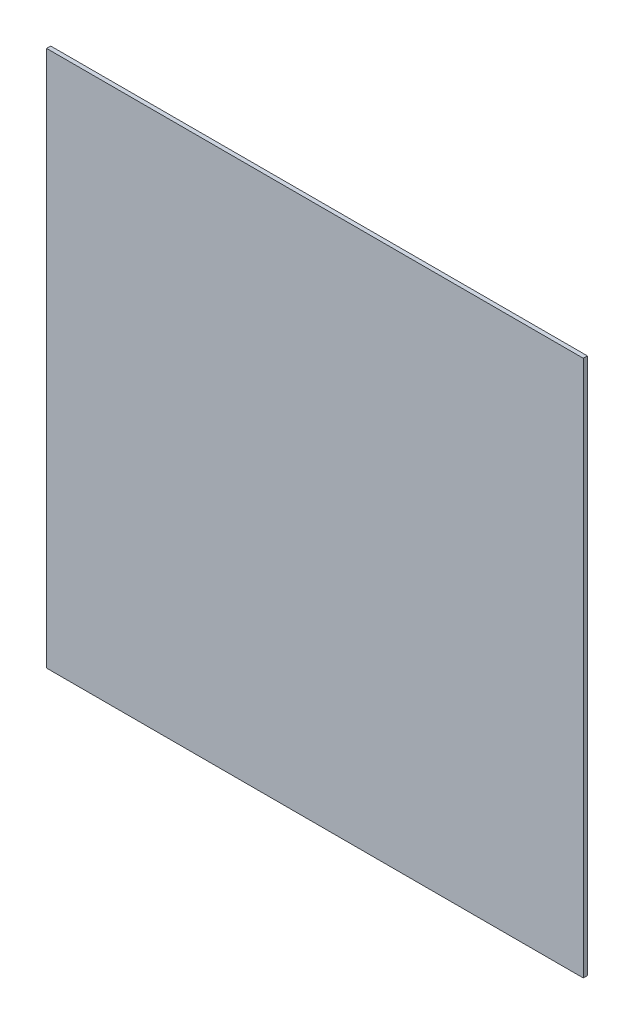
ISO-10303-21;
HEADER;
FILE_DESCRIPTION(('STEP AP214'),'2;1');
FILE_NAME('part.step','',(''),(''),'','','');
FILE_SCHEMA(('AUTOMOTIVE_DESIGN { 1 0 10303 214 1 1 1 1 }'));
ENDSEC;
DATA;
#1=APPLICATION_CONTEXT('core data for automotive mechanical design processes');
#2=APPLICATION_PROTOCOL_DEFINITION('international standard','automotive_design',2000,#1);
#3=PRODUCT_CONTEXT('',#1,'mechanical');
#4=PRODUCT('Part','Part','',(#3));
#5=PRODUCT_RELATED_PRODUCT_CATEGORY('part','',(#4));
#6=PRODUCT_DEFINITION_FORMATION('','',#4);
#7=PRODUCT_DEFINITION_CONTEXT('part definition',#1,'design');
#8=PRODUCT_DEFINITION('design','',#6,#7);
#9=PRODUCT_DEFINITION_SHAPE('','',#8);
#10=(LENGTH_UNIT() NAMED_UNIT(*) SI_UNIT(.MILLI.,.METRE.));
#11=(NAMED_UNIT(*) PLANE_ANGLE_UNIT() SI_UNIT($,.RADIAN.));
#12=(NAMED_UNIT(*) SI_UNIT($,.STERADIAN.) SOLID_ANGLE_UNIT());
#13=UNCERTAINTY_MEASURE_WITH_UNIT(LENGTH_MEASURE(1.E-05),#10,'distance_accuracy_value','');
#14=(GEOMETRIC_REPRESENTATION_CONTEXT(3) GLOBAL_UNCERTAINTY_ASSIGNED_CONTEXT((#13)) GLOBAL_UNIT_ASSIGNED_CONTEXT((#10,
#11,#12)) REPRESENTATION_CONTEXT('',''));
#15=CARTESIAN_POINT('',(0.,0.,0.));
#16=DIRECTION('',(0.,0.,1.));
#17=DIRECTION('',(1.,0.,0.));
#18=AXIS2_PLACEMENT_3D('',#15,#16,#17);
#19=CARTESIAN_POINT('',(650.,-650.,-7.));
#20=DIRECTION('',(1.,0.,0.));
#21=DIRECTION('',(0.,0.,-1.));
#22=AXIS2_PLACEMENT_3D('',#19,#20,#21);
#23=PLANE('',#22);
#24=DIRECTION('',(0.,1.,0.));
#25=VECTOR('',#24,1.);
#26=CARTESIAN_POINT('',(650.,-650.,3.));
#27=LINE('',#26,#25);
#28=CARTESIAN_POINT('',(650.,-650.,3.));
#29=VERTEX_POINT('',#28);
#30=CARTESIAN_POINT('',(650.,650.,3.));
#31=VERTEX_POINT('',#30);
#32=EDGE_CURVE('E99',#29,#31,#27,.T.);
#33=ORIENTED_EDGE('',*,*,#32,.F.);
#34=DIRECTION('',(0.,0.,1.));
#35=VECTOR('',#34,1.);
#36=CARTESIAN_POINT('',(650.,-650.,-7.));
#37=LINE('',#36,#35);
#38=CARTESIAN_POINT('',(650.,-650.,-7.));
#39=VERTEX_POINT('',#38);
#40=EDGE_CURVE('E11',#39,#29,#37,.T.);
#41=ORIENTED_EDGE('',*,*,#40,.F.);
#42=DIRECTION('',(0.,1.,0.));
#43=VECTOR('',#42,1.);
#44=CARTESIAN_POINT('',(650.,-650.,-7.));
#45=LINE('',#44,#43);
#46=CARTESIAN_POINT('',(650.,650.,-7.));
#47=VERTEX_POINT('',#46);
#48=EDGE_CURVE('E93',#39,#47,#45,.T.);
#49=ORIENTED_EDGE('',*,*,#48,.T.);
#50=DIRECTION('',(0.,0.,1.));
#51=VECTOR('',#50,1.);
#52=CARTESIAN_POINT('',(650.,650.,-7.));
#53=LINE('',#52,#51);
#54=EDGE_CURVE('E38',#47,#31,#53,.T.);
#55=ORIENTED_EDGE('',*,*,#54,.T.);
#56=EDGE_LOOP('',(#33,#41,#49,#55));
#57=FACE_BOUND('',#56,.T.);
#58=ADVANCED_FACE('F35',(#57),#23,.T.);
#59=CARTESIAN_POINT('',(-650.,-650.,-7.));
#60=DIRECTION('',(0.,-1.,0.));
#61=DIRECTION('',(0.,0.,-1.));
#62=AXIS2_PLACEMENT_3D('',#59,#60,#61);
#63=PLANE('',#62);
#64=DIRECTION('',(1.,0.,0.));
#65=VECTOR('',#64,1.);
#66=CARTESIAN_POINT('',(-650.,-650.,3.));
#67=LINE('',#66,#65);
#68=CARTESIAN_POINT('',(-650.,-650.,3.));
#69=VERTEX_POINT('',#68);
#70=EDGE_CURVE('E95',#69,#29,#67,.T.);
#71=ORIENTED_EDGE('',*,*,#70,.F.);
#72=DIRECTION('',(0.,0.,1.));
#73=VECTOR('',#72,1.);
#74=CARTESIAN_POINT('',(-650.,-650.,-7.));
#75=LINE('',#74,#73);
#76=CARTESIAN_POINT('',(-650.,-650.,-7.));
#77=VERTEX_POINT('',#76);
#78=EDGE_CURVE('E44',#77,#69,#75,.T.);
#79=ORIENTED_EDGE('',*,*,#78,.F.);
#80=DIRECTION('',(1.,0.,0.));
#81=VECTOR('',#80,1.);
#82=CARTESIAN_POINT('',(-650.,-650.,-7.));
#83=LINE('',#82,#81);
#84=EDGE_CURVE('E90',#77,#39,#83,.T.);
#85=ORIENTED_EDGE('',*,*,#84,.T.);
#86=ORIENTED_EDGE('',*,*,#40,.T.);
#87=EDGE_LOOP('',(#71,#79,#85,#86));
#88=FACE_BOUND('',#87,.T.);
#89=ADVANCED_FACE('F109',(#88),#63,.T.);
#90=CARTESIAN_POINT('',(-650.,-650.,-7.));
#91=DIRECTION('',(-1.,0.,0.));
#92=DIRECTION('',(0.,0.,1.));
#93=AXIS2_PLACEMENT_3D('',#90,#91,#92);
#94=PLANE('',#93);
#95=DIRECTION('',(0.,-1.,0.));
#96=VECTOR('',#95,1.);
#97=CARTESIAN_POINT('',(-650.,-650.,3.));
#98=LINE('',#97,#96);
#99=CARTESIAN_POINT('',(-650.,650.,3.));
#100=VERTEX_POINT('',#99);
#101=EDGE_CURVE('E85',#100,#69,#98,.T.);
#102=ORIENTED_EDGE('',*,*,#101,.F.);
#103=DIRECTION('',(0.,0.,1.));
#104=VECTOR('',#103,1.);
#105=CARTESIAN_POINT('',(-650.,650.,-7.));
#106=LINE('',#105,#104);
#107=CARTESIAN_POINT('',(-650.,650.,-7.));
#108=VERTEX_POINT('',#107);
#109=EDGE_CURVE('E80',#108,#100,#106,.T.);
#110=ORIENTED_EDGE('',*,*,#109,.F.);
#111=DIRECTION('',(0.,-1.,0.));
#112=VECTOR('',#111,1.);
#113=CARTESIAN_POINT('',(-650.,-650.,-7.));
#114=LINE('',#113,#112);
#115=EDGE_CURVE('E83',#108,#77,#114,.T.);
#116=ORIENTED_EDGE('',*,*,#115,.T.);
#117=ORIENTED_EDGE('',*,*,#78,.T.);
#118=EDGE_LOOP('',(#102,#110,#116,#117));
#119=FACE_BOUND('',#118,.T.);
#120=ADVANCED_FACE('F82',(#119),#94,.T.);
#121=CARTESIAN_POINT('',(-650.,650.,-7.));
#122=DIRECTION('',(0.,1.,0.));
#123=DIRECTION('',(0.,0.,1.));
#124=AXIS2_PLACEMENT_3D('',#121,#122,#123);
#125=PLANE('',#124);
#126=DIRECTION('',(-1.,0.,0.));
#127=VECTOR('',#126,1.);
#128=CARTESIAN_POINT('',(-650.,650.,3.));
#129=LINE('',#128,#127);
#130=EDGE_CURVE('E102',#31,#100,#129,.T.);
#131=ORIENTED_EDGE('',*,*,#130,.F.);
#132=ORIENTED_EDGE('',*,*,#54,.F.);
#133=DIRECTION('',(-1.,0.,0.));
#134=VECTOR('',#133,1.);
#135=CARTESIAN_POINT('',(-650.,650.,-7.));
#136=LINE('',#135,#134);
#137=EDGE_CURVE('E89',#47,#108,#136,.T.);
#138=ORIENTED_EDGE('',*,*,#137,.T.);
#139=ORIENTED_EDGE('',*,*,#109,.T.);
#140=EDGE_LOOP('',(#131,#132,#138,#139));
#141=FACE_BOUND('',#140,.T.);
#142=ADVANCED_FACE('F92',(#141),#125,.T.);
#143=CARTESIAN_POINT('',(0.,0.,-7.));
#144=DIRECTION('',(0.,0.,-1.));
#145=DIRECTION('',(-1.,0.,0.));
#146=AXIS2_PLACEMENT_3D('',#143,#144,#145);
#147=PLANE('',#146);
#148=ORIENTED_EDGE('',*,*,#48,.F.);
#149=ORIENTED_EDGE('',*,*,#84,.F.);
#150=ORIENTED_EDGE('',*,*,#115,.F.);
#151=ORIENTED_EDGE('',*,*,#137,.F.);
#152=EDGE_LOOP('',(#148,#149,#150,#151));
#153=FACE_BOUND('',#152,.T.);
#154=ADVANCED_FACE('F88',(#153),#147,.T.);
#155=CARTESIAN_POINT('',(0.,0.,3.));
#156=DIRECTION('',(0.,0.,-1.));
#157=DIRECTION('',(-1.,0.,0.));
#158=AXIS2_PLACEMENT_3D('',#155,#156,#157);
#159=PLANE('',#158);
#160=ORIENTED_EDGE('',*,*,#32,.T.);
#161=ORIENTED_EDGE('',*,*,#130,.T.);
#162=ORIENTED_EDGE('',*,*,#101,.T.);
#163=ORIENTED_EDGE('',*,*,#70,.T.);
#164=EDGE_LOOP('',(#160,#161,#162,#163));
#165=FACE_BOUND('',#164,.T.);
#166=ADVANCED_FACE('F108',(#165),#159,.F.);
#167=CLOSED_SHELL('',(#58,#89,#120,#142,#154,#166));
#168=MANIFOLD_SOLID_BREP('B2',#167);
#169=ADVANCED_BREP_SHAPE_REPRESENTATION('',(#18,#168),#14);
#170=SHAPE_DEFINITION_REPRESENTATION(#9,#169);
ENDSEC;
END-ISO-10303-21;
